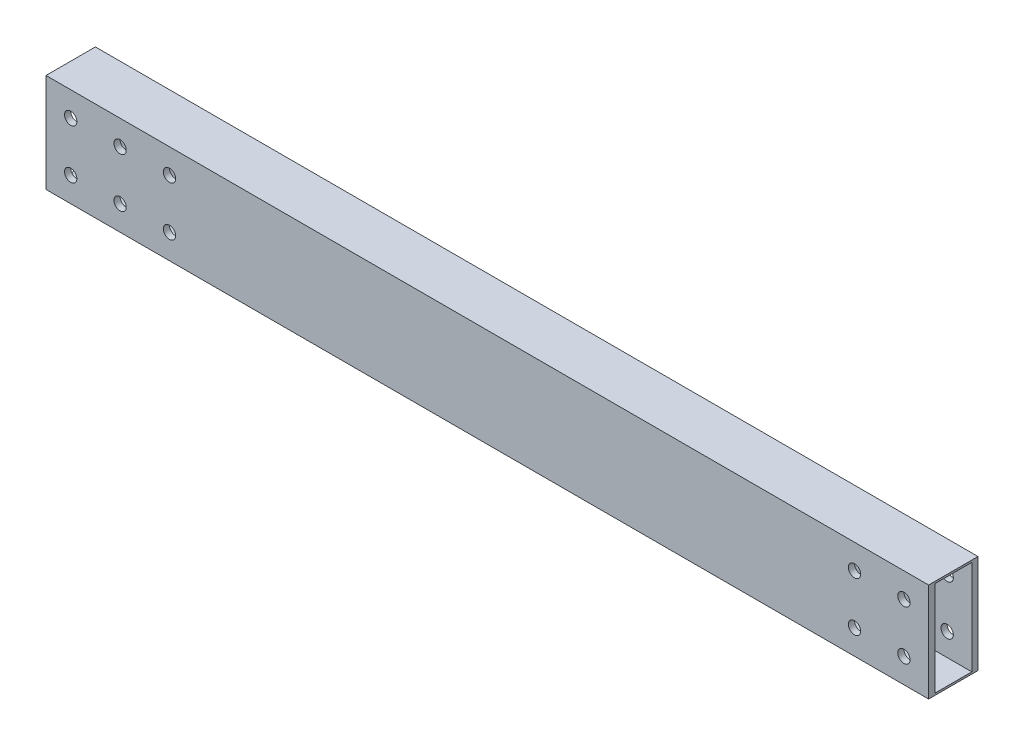
ISO-10303-21;
HEADER;
FILE_DESCRIPTION(('STEP AP214'),'2;1');
FILE_NAME('part.step','',(''),(''),'','','');
FILE_SCHEMA(('AUTOMOTIVE_DESIGN { 1 0 10303 214 1 1 1 1 }'));
ENDSEC;
DATA;
#1=APPLICATION_CONTEXT('core data for automotive mechanical design processes');
#2=APPLICATION_PROTOCOL_DEFINITION('international standard','automotive_design',2000,#1);
#3=PRODUCT_CONTEXT('',#1,'mechanical');
#4=PRODUCT('Part','Part','',(#3));
#5=PRODUCT_RELATED_PRODUCT_CATEGORY('part','',(#4));
#6=PRODUCT_DEFINITION_FORMATION('','',#4);
#7=PRODUCT_DEFINITION_CONTEXT('part definition',#1,'design');
#8=PRODUCT_DEFINITION('design','',#6,#7);
#9=PRODUCT_DEFINITION_SHAPE('','',#8);
#10=(LENGTH_UNIT() NAMED_UNIT(*) SI_UNIT(.MILLI.,.METRE.));
#11=(NAMED_UNIT(*) PLANE_ANGLE_UNIT() SI_UNIT($,.RADIAN.));
#12=(NAMED_UNIT(*) SI_UNIT($,.STERADIAN.) SOLID_ANGLE_UNIT());
#13=UNCERTAINTY_MEASURE_WITH_UNIT(LENGTH_MEASURE(1.E-05),#10,'distance_accuracy_value','');
#14=(GEOMETRIC_REPRESENTATION_CONTEXT(3) GLOBAL_UNCERTAINTY_ASSIGNED_CONTEXT((#13)) GLOBAL_UNIT_ASSIGNED_CONTEXT((#10,
#11,#12)) REPRESENTATION_CONTEXT('',''));
#15=CARTESIAN_POINT('',(0.,0.,0.));
#16=DIRECTION('',(0.,0.,1.));
#17=DIRECTION('',(1.,0.,0.));
#18=AXIS2_PLACEMENT_3D('',#15,#16,#17);
#19=CARTESIAN_POINT('',(453.936862,0.,0.));
#20=DIRECTION('',(0.,0.,-1.));
#21=DIRECTION('',(-1.,0.,0.));
#22=AXIS2_PLACEMENT_3D('',#19,#20,#21);
#23=PLANE('',#22);
#24=CARTESIAN_POINT('',(415.836862,12.7,0.));
#25=DIRECTION('',(0.,0.,-1.));
#26=DIRECTION('',(-1.,0.,0.));
#27=AXIS2_PLACEMENT_3D('',#24,#25,#26);
#28=CIRCLE('',#27,3.17499999999997);
#29=CARTESIAN_POINT('',(412.661862,12.7,0.));
#30=VERTEX_POINT('',#29);
#31=EDGE_CURVE('E146',#30,#30,#28,.T.);
#32=ORIENTED_EDGE('',*,*,#31,.T.);
#33=EDGE_LOOP('',(#32));
#34=FACE_BOUND('',#33,.T.);
#35=CARTESIAN_POINT('',(63.5,12.7,0.));
#36=DIRECTION('',(0.,0.,-1.));
#37=DIRECTION('',(-1.,0.,0.));
#38=AXIS2_PLACEMENT_3D('',#35,#36,#37);
#39=CIRCLE('',#38,3.175);
#40=CARTESIAN_POINT('',(60.325,12.7,0.));
#41=VERTEX_POINT('',#40);
#42=EDGE_CURVE('E263',#41,#41,#39,.T.);
#43=ORIENTED_EDGE('',*,*,#42,.T.);
#44=EDGE_LOOP('',(#43));
#45=FACE_BOUND('',#44,.T.);
#46=CARTESIAN_POINT('',(63.5,38.1,0.));
#47=DIRECTION('',(0.,0.,-1.));
#48=DIRECTION('',(-1.,0.,0.));
#49=AXIS2_PLACEMENT_3D('',#46,#47,#48);
#50=CIRCLE('',#49,3.175);
#51=CARTESIAN_POINT('',(60.325,38.1,0.));
#52=VERTEX_POINT('',#51);
#53=EDGE_CURVE('E257',#52,#52,#50,.T.);
#54=ORIENTED_EDGE('',*,*,#53,.T.);
#55=EDGE_LOOP('',(#54));
#56=FACE_BOUND('',#55,.T.);
#57=CARTESIAN_POINT('',(415.836862,38.1,0.));
#58=DIRECTION('',(0.,0.,-1.));
#59=DIRECTION('',(-1.,0.,0.));
#60=AXIS2_PLACEMENT_3D('',#57,#58,#59);
#61=CIRCLE('',#60,3.17499999999997);
#62=CARTESIAN_POINT('',(412.661862,38.1,0.));
#63=VERTEX_POINT('',#62);
#64=EDGE_CURVE('E252',#63,#63,#61,.T.);
#65=ORIENTED_EDGE('',*,*,#64,.T.);
#66=EDGE_LOOP('',(#65));
#67=FACE_BOUND('',#66,.T.);
#68=CARTESIAN_POINT('',(38.1,38.1,0.));
#69=DIRECTION('',(0.,0.,-1.));
#70=DIRECTION('',(-1.,0.,0.));
#71=AXIS2_PLACEMENT_3D('',#68,#69,#70);
#72=CIRCLE('',#71,3.175);
#73=CARTESIAN_POINT('',(34.925,38.1,0.));
#74=VERTEX_POINT('',#73);
#75=EDGE_CURVE('E247',#74,#74,#72,.T.);
#76=ORIENTED_EDGE('',*,*,#75,.T.);
#77=EDGE_LOOP('',(#76));
#78=FACE_BOUND('',#77,.T.);
#79=CARTESIAN_POINT('',(441.236862,12.7,0.));
#80=DIRECTION('',(0.,0.,-1.));
#81=DIRECTION('',(-1.,0.,0.));
#82=AXIS2_PLACEMENT_3D('',#79,#80,#81);
#83=CIRCLE('',#82,3.17499999999997);
#84=CARTESIAN_POINT('',(438.061862,12.7,0.));
#85=VERTEX_POINT('',#84);
#86=EDGE_CURVE('E241',#85,#85,#83,.T.);
#87=ORIENTED_EDGE('',*,*,#86,.T.);
#88=EDGE_LOOP('',(#87));
#89=FACE_BOUND('',#88,.T.);
#90=CARTESIAN_POINT('',(12.7,12.7,0.));
#91=DIRECTION('',(0.,0.,-1.));
#92=DIRECTION('',(-1.,0.,0.));
#93=AXIS2_PLACEMENT_3D('',#90,#91,#92);
#94=CIRCLE('',#93,3.175);
#95=CARTESIAN_POINT('',(9.525,12.7,0.));
#96=VERTEX_POINT('',#95);
#97=EDGE_CURVE('E235',#96,#96,#94,.T.);
#98=ORIENTED_EDGE('',*,*,#97,.T.);
#99=EDGE_LOOP('',(#98));
#100=FACE_BOUND('',#99,.T.);
#101=CARTESIAN_POINT('',(38.1,12.7,0.));
#102=DIRECTION('',(0.,0.,-1.));
#103=DIRECTION('',(-1.,0.,0.));
#104=AXIS2_PLACEMENT_3D('',#101,#102,#103);
#105=CIRCLE('',#104,3.175);
#106=CARTESIAN_POINT('',(34.925,12.7,0.));
#107=VERTEX_POINT('',#106);
#108=EDGE_CURVE('E229',#107,#107,#105,.T.);
#109=ORIENTED_EDGE('',*,*,#108,.T.);
#110=EDGE_LOOP('',(#109));
#111=FACE_BOUND('',#110,.T.);
#112=CARTESIAN_POINT('',(441.236862,38.1,0.));
#113=DIRECTION('',(0.,0.,-1.));
#114=DIRECTION('',(-1.,0.,0.));
#115=AXIS2_PLACEMENT_3D('',#112,#113,#114);
#116=CIRCLE('',#115,3.17499999999997);
#117=CARTESIAN_POINT('',(438.061862,38.1,0.));
#118=VERTEX_POINT('',#117);
#119=EDGE_CURVE('E223',#118,#118,#116,.T.);
#120=ORIENTED_EDGE('',*,*,#119,.T.);
#121=EDGE_LOOP('',(#120));
#122=FACE_BOUND('',#121,.T.);
#123=CARTESIAN_POINT('',(12.7,38.1,0.));
#124=DIRECTION('',(0.,0.,-1.));
#125=DIRECTION('',(-1.,0.,0.));
#126=AXIS2_PLACEMENT_3D('',#123,#124,#125);
#127=CIRCLE('',#126,3.175);
#128=CARTESIAN_POINT('',(9.525,38.1,0.));
#129=VERTEX_POINT('',#128);
#130=EDGE_CURVE('E217',#129,#129,#127,.T.);
#131=ORIENTED_EDGE('',*,*,#130,.T.);
#132=EDGE_LOOP('',(#131));
#133=FACE_BOUND('',#132,.T.);
#134=DIRECTION('',(0.,-1.,0.));
#135=VECTOR('',#134,1.);
#136=CARTESIAN_POINT('',(0.,0.,0.));
#137=LINE('',#136,#135);
#138=CARTESIAN_POINT('',(0.,50.8,0.));
#139=VERTEX_POINT('',#138);
#140=CARTESIAN_POINT('',(0.,0.,0.));
#141=VERTEX_POINT('',#140);
#142=EDGE_CURVE('E164',#139,#141,#137,.T.);
#143=ORIENTED_EDGE('',*,*,#142,.T.);
#144=DIRECTION('',(-1.,0.,0.));
#145=VECTOR('',#144,1.);
#146=CARTESIAN_POINT('',(453.936862,0.,0.));
#147=LINE('',#146,#145);
#148=CARTESIAN_POINT('',(453.936862,0.,0.));
#149=VERTEX_POINT('',#148);
#150=EDGE_CURVE('E11',#149,#141,#147,.T.);
#151=ORIENTED_EDGE('',*,*,#150,.F.);
#152=DIRECTION('',(0.,-1.,0.));
#153=VECTOR('',#152,1.);
#154=CARTESIAN_POINT('',(453.936862,0.,0.));
#155=LINE('',#154,#153);
#156=CARTESIAN_POINT('',(453.936862,50.8,0.));
#157=VERTEX_POINT('',#156);
#158=EDGE_CURVE('E170',#157,#149,#155,.T.);
#159=ORIENTED_EDGE('',*,*,#158,.F.);
#160=DIRECTION('',(-1.,0.,0.));
#161=VECTOR('',#160,1.);
#162=CARTESIAN_POINT('',(453.936862,50.8,0.));
#163=LINE('',#162,#161);
#164=EDGE_CURVE('E184',#157,#139,#163,.T.);
#165=ORIENTED_EDGE('',*,*,#164,.T.);
#166=EDGE_LOOP('',(#143,#151,#159,#165));
#167=FACE_BOUND('',#166,.T.);
#168=ADVANCED_FACE('F51',(#34,#45,#56,#67,#78,#89,#100,#111,#122,#133,#167),#23,.F.);
#169=CARTESIAN_POINT('',(453.936862,0.,0.));
#170=DIRECTION('',(0.,1.,0.));
#171=DIRECTION('',(0.,0.,1.));
#172=AXIS2_PLACEMENT_3D('',#169,#170,#171);
#173=PLANE('',#172);
#174=DIRECTION('',(0.,0.,-1.));
#175=VECTOR('',#174,1.);
#176=CARTESIAN_POINT('',(0.,0.,0.));
#177=LINE('',#176,#175);
#178=CARTESIAN_POINT('',(0.,0.,-25.4));
#179=VERTEX_POINT('',#178);
#180=EDGE_CURVE('E188',#141,#179,#177,.T.);
#181=ORIENTED_EDGE('',*,*,#180,.T.);
#182=DIRECTION('',(-1.,0.,0.));
#183=VECTOR('',#182,1.);
#184=CARTESIAN_POINT('',(453.936862,0.,-25.4));
#185=LINE('',#184,#183);
#186=CARTESIAN_POINT('',(453.936862,0.,-25.4));
#187=VERTEX_POINT('',#186);
#188=EDGE_CURVE('E60',#187,#179,#185,.T.);
#189=ORIENTED_EDGE('',*,*,#188,.F.);
#190=DIRECTION('',(0.,0.,-1.));
#191=VECTOR('',#190,1.);
#192=CARTESIAN_POINT('',(453.936862,0.,0.));
#193=LINE('',#192,#191);
#194=EDGE_CURVE('E174',#149,#187,#193,.T.);
#195=ORIENTED_EDGE('',*,*,#194,.F.);
#196=ORIENTED_EDGE('',*,*,#150,.T.);
#197=EDGE_LOOP('',(#181,#189,#195,#196));
#198=FACE_BOUND('',#197,.T.);
#199=ADVANCED_FACE('F313',(#198),#173,.F.);
#200=CARTESIAN_POINT('',(453.936862,0.,-25.4));
#201=DIRECTION('',(0.,0.,1.));
#202=DIRECTION('',(1.,0.,0.));
#203=AXIS2_PLACEMENT_3D('',#200,#201,#202);
#204=PLANE('',#203);
#205=CARTESIAN_POINT('',(415.836862,12.7,-25.4));
#206=DIRECTION('',(0.,0.,1.));
#207=DIRECTION('',(1.,0.,0.));
#208=AXIS2_PLACEMENT_3D('',#205,#206,#207);
#209=CIRCLE('',#208,3.17499999999997);
#210=CARTESIAN_POINT('',(419.011862,12.7,-25.4));
#211=VERTEX_POINT('',#210);
#212=EDGE_CURVE('E537',#211,#211,#209,.T.);
#213=ORIENTED_EDGE('',*,*,#212,.T.);
#214=EDGE_LOOP('',(#213));
#215=FACE_BOUND('',#214,.T.);
#216=CARTESIAN_POINT('',(63.5,12.7,-25.4));
#217=DIRECTION('',(0.,0.,1.));
#218=DIRECTION('',(1.,0.,0.));
#219=AXIS2_PLACEMENT_3D('',#216,#217,#218);
#220=CIRCLE('',#219,3.175);
#221=CARTESIAN_POINT('',(66.675,12.7,-25.4));
#222=VERTEX_POINT('',#221);
#223=EDGE_CURVE('E529',#222,#222,#220,.T.);
#224=ORIENTED_EDGE('',*,*,#223,.T.);
#225=EDGE_LOOP('',(#224));
#226=FACE_BOUND('',#225,.T.);
#227=CARTESIAN_POINT('',(63.5,38.1,-25.4));
#228=DIRECTION('',(0.,0.,1.));
#229=DIRECTION('',(1.,0.,0.));
#230=AXIS2_PLACEMENT_3D('',#227,#228,#229);
#231=CIRCLE('',#230,3.175);
#232=CARTESIAN_POINT('',(66.675,38.1,-25.4));
#233=VERTEX_POINT('',#232);
#234=EDGE_CURVE('E522',#233,#233,#231,.T.);
#235=ORIENTED_EDGE('',*,*,#234,.T.);
#236=EDGE_LOOP('',(#235));
#237=FACE_BOUND('',#236,.T.);
#238=CARTESIAN_POINT('',(415.836862,38.1,-25.4));
#239=DIRECTION('',(0.,0.,1.));
#240=DIRECTION('',(1.,0.,0.));
#241=AXIS2_PLACEMENT_3D('',#238,#239,#240);
#242=CIRCLE('',#241,3.17499999999997);
#243=CARTESIAN_POINT('',(419.011862,38.1,-25.4));
#244=VERTEX_POINT('',#243);
#245=EDGE_CURVE('E510',#244,#244,#242,.T.);
#246=ORIENTED_EDGE('',*,*,#245,.T.);
#247=EDGE_LOOP('',(#246));
#248=FACE_BOUND('',#247,.T.);
#249=CARTESIAN_POINT('',(38.1,38.1,-25.4));
#250=DIRECTION('',(0.,0.,1.));
#251=DIRECTION('',(1.,0.,0.));
#252=AXIS2_PLACEMENT_3D('',#249,#250,#251);
#253=CIRCLE('',#252,3.175);
#254=CARTESIAN_POINT('',(41.275,38.1,-25.4));
#255=VERTEX_POINT('',#254);
#256=EDGE_CURVE('E444',#255,#255,#253,.T.);
#257=ORIENTED_EDGE('',*,*,#256,.T.);
#258=EDGE_LOOP('',(#257));
#259=FACE_BOUND('',#258,.T.);
#260=CARTESIAN_POINT('',(441.236862,12.7,-25.4));
#261=DIRECTION('',(0.,0.,1.));
#262=DIRECTION('',(1.,0.,0.));
#263=AXIS2_PLACEMENT_3D('',#260,#261,#262);
#264=CIRCLE('',#263,3.17499999999997);
#265=CARTESIAN_POINT('',(444.411862,12.7,-25.4));
#266=VERTEX_POINT('',#265);
#267=EDGE_CURVE('E448',#266,#266,#264,.T.);
#268=ORIENTED_EDGE('',*,*,#267,.T.);
#269=EDGE_LOOP('',(#268));
#270=FACE_BOUND('',#269,.T.);
#271=CARTESIAN_POINT('',(12.7,12.7,-25.4));
#272=DIRECTION('',(0.,0.,1.));
#273=DIRECTION('',(1.,0.,0.));
#274=AXIS2_PLACEMENT_3D('',#271,#272,#273);
#275=CIRCLE('',#274,3.175);
#276=CARTESIAN_POINT('',(15.875,12.7,-25.4));
#277=VERTEX_POINT('',#276);
#278=EDGE_CURVE('E421',#277,#277,#275,.T.);
#279=ORIENTED_EDGE('',*,*,#278,.T.);
#280=EDGE_LOOP('',(#279));
#281=FACE_BOUND('',#280,.T.);
#282=CARTESIAN_POINT('',(38.1,12.7,-25.4));
#283=DIRECTION('',(0.,0.,1.));
#284=DIRECTION('',(1.,0.,0.));
#285=AXIS2_PLACEMENT_3D('',#282,#283,#284);
#286=CIRCLE('',#285,3.175);
#287=CARTESIAN_POINT('',(41.275,12.7,-25.4));
#288=VERTEX_POINT('',#287);
#289=EDGE_CURVE('E521',#288,#288,#286,.T.);
#290=ORIENTED_EDGE('',*,*,#289,.T.);
#291=EDGE_LOOP('',(#290));
#292=FACE_BOUND('',#291,.T.);
#293=CARTESIAN_POINT('',(441.236862,38.1,-25.4));
#294=DIRECTION('',(0.,0.,1.));
#295=DIRECTION('',(1.,0.,0.));
#296=AXIS2_PLACEMENT_3D('',#293,#294,#295);
#297=CIRCLE('',#296,3.17499999999997);
#298=CARTESIAN_POINT('',(444.411862,38.1,-25.4));
#299=VERTEX_POINT('',#298);
#300=EDGE_CURVE('E532',#299,#299,#297,.T.);
#301=ORIENTED_EDGE('',*,*,#300,.T.);
#302=EDGE_LOOP('',(#301));
#303=FACE_BOUND('',#302,.T.);
#304=CARTESIAN_POINT('',(12.7,38.1,-25.4));
#305=DIRECTION('',(0.,0.,1.));
#306=DIRECTION('',(1.,0.,0.));
#307=AXIS2_PLACEMENT_3D('',#304,#305,#306);
#308=CIRCLE('',#307,3.175);
#309=CARTESIAN_POINT('',(15.875,38.1,-25.4));
#310=VERTEX_POINT('',#309);
#311=EDGE_CURVE('E211',#310,#310,#308,.T.);
#312=ORIENTED_EDGE('',*,*,#311,.T.);
#313=EDGE_LOOP('',(#312));
#314=FACE_BOUND('',#313,.T.);
#315=DIRECTION('',(0.,1.,0.));
#316=VECTOR('',#315,1.);
#317=CARTESIAN_POINT('',(0.,0.,-25.4));
#318=LINE('',#317,#316);
#319=CARTESIAN_POINT('',(0.,50.8,-25.4));
#320=VERTEX_POINT('',#319);
#321=EDGE_CURVE('E191',#179,#320,#318,.T.);
#322=ORIENTED_EDGE('',*,*,#321,.T.);
#323=DIRECTION('',(-1.,0.,0.));
#324=VECTOR('',#323,1.);
#325=CARTESIAN_POINT('',(453.936862,50.8,-25.4));
#326=LINE('',#325,#324);
#327=CARTESIAN_POINT('',(453.936862,50.8,-25.4));
#328=VERTEX_POINT('',#327);
#329=EDGE_CURVE('E199',#328,#320,#326,.T.);
#330=ORIENTED_EDGE('',*,*,#329,.F.);
#331=DIRECTION('',(0.,1.,0.));
#332=VECTOR('',#331,1.);
#333=CARTESIAN_POINT('',(453.936862,0.,-25.4));
#334=LINE('',#333,#332);
#335=EDGE_CURVE('E178',#187,#328,#334,.T.);
#336=ORIENTED_EDGE('',*,*,#335,.F.);
#337=ORIENTED_EDGE('',*,*,#188,.T.);
#338=EDGE_LOOP('',(#322,#330,#336,#337));
#339=FACE_BOUND('',#338,.T.);
#340=ADVANCED_FACE('F318',(#215,#226,#237,#248,#259,#270,#281,#292,#303,#314,#339),#204,.F.);
#341=CARTESIAN_POINT('',(453.936862,50.8,0.));
#342=DIRECTION('',(0.,-1.,0.));
#343=DIRECTION('',(0.,0.,-1.));
#344=AXIS2_PLACEMENT_3D('',#341,#342,#343);
#345=PLANE('',#344);
#346=DIRECTION('',(0.,0.,1.));
#347=VECTOR('',#346,1.);
#348=CARTESIAN_POINT('',(0.,50.8,0.));
#349=LINE('',#348,#347);
#350=EDGE_CURVE('E175',#320,#139,#349,.T.);
#351=ORIENTED_EDGE('',*,*,#350,.T.);
#352=ORIENTED_EDGE('',*,*,#164,.F.);
#353=DIRECTION('',(0.,0.,1.));
#354=VECTOR('',#353,1.);
#355=CARTESIAN_POINT('',(453.936862,50.8,0.));
#356=LINE('',#355,#354);
#357=EDGE_CURVE('E181',#328,#157,#356,.T.);
#358=ORIENTED_EDGE('',*,*,#357,.F.);
#359=ORIENTED_EDGE('',*,*,#329,.T.);
#360=EDGE_LOOP('',(#351,#352,#358,#359));
#361=FACE_BOUND('',#360,.T.);
#362=ADVANCED_FACE('F358',(#361),#345,.F.);
#363=CARTESIAN_POINT('',(453.936862,0.,0.));
#364=DIRECTION('',(-1.,0.,0.));
#365=DIRECTION('',(0.,0.,1.));
#366=AXIS2_PLACEMENT_3D('',#363,#364,#365);
#367=PLANE('',#366);
#368=DIRECTION('',(0.,0.,-1.));
#369=VECTOR('',#368,1.);
#370=CARTESIAN_POINT('',(453.936862,1.016,-3.17500000000001));
#371=LINE('',#370,#369);
#372=CARTESIAN_POINT('',(453.936862,1.016,-3.17500000000001));
#373=VERTEX_POINT('',#372);
#374=CARTESIAN_POINT('',(453.936862,1.016,-22.225));
#375=VERTEX_POINT('',#374);
#376=EDGE_CURVE('E155',#373,#375,#371,.T.);
#377=ORIENTED_EDGE('',*,*,#376,.F.);
#378=DIRECTION('',(0.,-1.,0.));
#379=VECTOR('',#378,1.);
#380=CARTESIAN_POINT('',(453.936862,49.784,-3.175));
#381=LINE('',#380,#379);
#382=CARTESIAN_POINT('',(453.936862,49.784,-3.175));
#383=VERTEX_POINT('',#382);
#384=EDGE_CURVE('E68',#383,#373,#381,.T.);
#385=ORIENTED_EDGE('',*,*,#384,.F.);
#386=DIRECTION('',(0.,0.,1.));
#387=VECTOR('',#386,1.);
#388=CARTESIAN_POINT('',(453.936862,49.784,-3.175));
#389=LINE('',#388,#387);
#390=CARTESIAN_POINT('',(453.936862,49.784,-22.225));
#391=VERTEX_POINT('',#390);
#392=EDGE_CURVE('E139',#391,#383,#389,.T.);
#393=ORIENTED_EDGE('',*,*,#392,.F.);
#394=DIRECTION('',(0.,1.,0.));
#395=VECTOR('',#394,1.);
#396=CARTESIAN_POINT('',(453.936862,49.784,-22.225));
#397=LINE('',#396,#395);
#398=EDGE_CURVE('E143',#375,#391,#397,.T.);
#399=ORIENTED_EDGE('',*,*,#398,.F.);
#400=EDGE_LOOP('',(#377,#385,#393,#399));
#401=FACE_BOUND('',#400,.T.);
#402=ORIENTED_EDGE('',*,*,#158,.T.);
#403=ORIENTED_EDGE('',*,*,#194,.T.);
#404=ORIENTED_EDGE('',*,*,#335,.T.);
#405=ORIENTED_EDGE('',*,*,#357,.T.);
#406=EDGE_LOOP('',(#402,#403,#404,#405));
#407=FACE_BOUND('',#406,.T.);
#408=ADVANCED_FACE('F354',(#401,#407),#367,.F.);
#409=CARTESIAN_POINT('',(0.,0.,0.));
#410=DIRECTION('',(-1.,0.,0.));
#411=DIRECTION('',(0.,0.,1.));
#412=AXIS2_PLACEMENT_3D('',#409,#410,#411);
#413=PLANE('',#412);
#414=DIRECTION('',(0.,-1.,0.));
#415=VECTOR('',#414,1.);
#416=CARTESIAN_POINT('',(0.,49.784,-3.175));
#417=LINE('',#416,#415);
#418=CARTESIAN_POINT('',(0.,49.784,-3.175));
#419=VERTEX_POINT('',#418);
#420=CARTESIAN_POINT('',(0.,1.016,-3.17500000000001));
#421=VERTEX_POINT('',#420);
#422=EDGE_CURVE('E120',#419,#421,#417,.T.);
#423=ORIENTED_EDGE('',*,*,#422,.T.);
#424=DIRECTION('',(0.,0.,-1.));
#425=VECTOR('',#424,1.);
#426=CARTESIAN_POINT('',(0.,1.016,-3.17500000000001));
#427=LINE('',#426,#425);
#428=CARTESIAN_POINT('',(0.,1.016,-22.225));
#429=VERTEX_POINT('',#428);
#430=EDGE_CURVE('E130',#421,#429,#427,.T.);
#431=ORIENTED_EDGE('',*,*,#430,.T.);
#432=DIRECTION('',(0.,1.,0.));
#433=VECTOR('',#432,1.);
#434=CARTESIAN_POINT('',(0.,49.784,-22.225));
#435=LINE('',#434,#433);
#436=CARTESIAN_POINT('',(0.,49.784,-22.225));
#437=VERTEX_POINT('',#436);
#438=EDGE_CURVE('E76',#429,#437,#435,.T.);
#439=ORIENTED_EDGE('',*,*,#438,.T.);
#440=DIRECTION('',(0.,0.,1.));
#441=VECTOR('',#440,1.);
#442=CARTESIAN_POINT('',(0.,49.784,-3.175));
#443=LINE('',#442,#441);
#444=EDGE_CURVE('E127',#437,#419,#443,.T.);
#445=ORIENTED_EDGE('',*,*,#444,.T.);
#446=EDGE_LOOP('',(#423,#431,#439,#445));
#447=FACE_BOUND('',#446,.T.);
#448=ORIENTED_EDGE('',*,*,#142,.F.);
#449=ORIENTED_EDGE('',*,*,#350,.F.);
#450=ORIENTED_EDGE('',*,*,#321,.F.);
#451=ORIENTED_EDGE('',*,*,#180,.F.);
#452=EDGE_LOOP('',(#448,#449,#450,#451));
#453=FACE_BOUND('',#452,.T.);
#454=ADVANCED_FACE('F135',(#447,#453),#413,.T.);
#455=CARTESIAN_POINT('',(0.,49.784,-3.175));
#456=DIRECTION('',(0.,0.,1.));
#457=DIRECTION('',(0.,-1.,0.));
#458=AXIS2_PLACEMENT_3D('',#455,#456,#457);
#459=PLANE('',#458);
#460=CARTESIAN_POINT('',(415.836862,12.7,-3.175));
#461=DIRECTION('',(0.,0.,1.));
#462=DIRECTION('',(0.,-1.,0.));
#463=AXIS2_PLACEMENT_3D('',#460,#461,#462);
#464=CIRCLE('',#463,3.17499999999997);
#465=CARTESIAN_POINT('',(415.836862,9.52500000000003,-3.175));
#466=VERTEX_POINT('',#465);
#467=EDGE_CURVE('E276',#466,#466,#464,.T.);
#468=ORIENTED_EDGE('',*,*,#467,.T.);
#469=EDGE_LOOP('',(#468));
#470=FACE_BOUND('',#469,.T.);
#471=CARTESIAN_POINT('',(63.5,12.7,-3.175));
#472=DIRECTION('',(0.,0.,1.));
#473=DIRECTION('',(0.,-1.,0.));
#474=AXIS2_PLACEMENT_3D('',#471,#472,#473);
#475=CIRCLE('',#474,3.175);
#476=CARTESIAN_POINT('',(63.5,9.525,-3.175));
#477=VERTEX_POINT('',#476);
#478=EDGE_CURVE('E256',#477,#477,#475,.T.);
#479=ORIENTED_EDGE('',*,*,#478,.T.);
#480=EDGE_LOOP('',(#479));
#481=FACE_BOUND('',#480,.T.);
#482=CARTESIAN_POINT('',(63.5,38.1,-3.175));
#483=DIRECTION('',(0.,0.,1.));
#484=DIRECTION('',(0.,-1.,0.));
#485=AXIS2_PLACEMENT_3D('',#482,#483,#484);
#486=CIRCLE('',#485,3.175);
#487=CARTESIAN_POINT('',(63.5,34.925,-3.175));
#488=VERTEX_POINT('',#487);
#489=EDGE_CURVE('E251',#488,#488,#486,.T.);
#490=ORIENTED_EDGE('',*,*,#489,.T.);
#491=EDGE_LOOP('',(#490));
#492=FACE_BOUND('',#491,.T.);
#493=CARTESIAN_POINT('',(415.836862,38.1,-3.175));
#494=DIRECTION('',(0.,0.,1.));
#495=DIRECTION('',(0.,-1.,0.));
#496=AXIS2_PLACEMENT_3D('',#493,#494,#495);
#497=CIRCLE('',#496,3.17499999999997);
#498=CARTESIAN_POINT('',(415.836862,34.925,-3.175));
#499=VERTEX_POINT('',#498);
#500=EDGE_CURVE('E246',#499,#499,#497,.T.);
#501=ORIENTED_EDGE('',*,*,#500,.T.);
#502=EDGE_LOOP('',(#501));
#503=FACE_BOUND('',#502,.T.);
#504=CARTESIAN_POINT('',(38.1,38.1,-3.175));
#505=DIRECTION('',(0.,0.,1.));
#506=DIRECTION('',(0.,-1.,0.));
#507=AXIS2_PLACEMENT_3D('',#504,#505,#506);
#508=CIRCLE('',#507,3.175);
#509=CARTESIAN_POINT('',(38.1,34.925,-3.175));
#510=VERTEX_POINT('',#509);
#511=EDGE_CURVE('E240',#510,#510,#508,.T.);
#512=ORIENTED_EDGE('',*,*,#511,.T.);
#513=EDGE_LOOP('',(#512));
#514=FACE_BOUND('',#513,.T.);
#515=CARTESIAN_POINT('',(441.236862,12.7,-3.175));
#516=DIRECTION('',(0.,0.,1.));
#517=DIRECTION('',(0.,-1.,0.));
#518=AXIS2_PLACEMENT_3D('',#515,#516,#517);
#519=CIRCLE('',#518,3.17499999999997);
#520=CARTESIAN_POINT('',(441.236862,9.52500000000003,-3.175));
#521=VERTEX_POINT('',#520);
#522=EDGE_CURVE('E234',#521,#521,#519,.T.);
#523=ORIENTED_EDGE('',*,*,#522,.T.);
#524=EDGE_LOOP('',(#523));
#525=FACE_BOUND('',#524,.T.);
#526=CARTESIAN_POINT('',(12.7,12.7,-3.175));
#527=DIRECTION('',(0.,0.,1.));
#528=DIRECTION('',(0.,-1.,0.));
#529=AXIS2_PLACEMENT_3D('',#526,#527,#528);
#530=CIRCLE('',#529,3.175);
#531=CARTESIAN_POINT('',(12.7,9.525,-3.175));
#532=VERTEX_POINT('',#531);
#533=EDGE_CURVE('E228',#532,#532,#530,.T.);
#534=ORIENTED_EDGE('',*,*,#533,.T.);
#535=EDGE_LOOP('',(#534));
#536=FACE_BOUND('',#535,.T.);
#537=CARTESIAN_POINT('',(38.1,12.7,-3.175));
#538=DIRECTION('',(0.,0.,1.));
#539=DIRECTION('',(0.,-1.,0.));
#540=AXIS2_PLACEMENT_3D('',#537,#538,#539);
#541=CIRCLE('',#540,3.175);
#542=CARTESIAN_POINT('',(38.1,9.525,-3.175));
#543=VERTEX_POINT('',#542);
#544=EDGE_CURVE('E222',#543,#543,#541,.T.);
#545=ORIENTED_EDGE('',*,*,#544,.T.);
#546=EDGE_LOOP('',(#545));
#547=FACE_BOUND('',#546,.T.);
#548=CARTESIAN_POINT('',(441.236862,38.1,-3.175));
#549=DIRECTION('',(0.,0.,1.));
#550=DIRECTION('',(0.,-1.,0.));
#551=AXIS2_PLACEMENT_3D('',#548,#549,#550);
#552=CIRCLE('',#551,3.17499999999997);
#553=CARTESIAN_POINT('',(441.236862,34.925,-3.175));
#554=VERTEX_POINT('',#553);
#555=EDGE_CURVE('E216',#554,#554,#552,.T.);
#556=ORIENTED_EDGE('',*,*,#555,.T.);
#557=EDGE_LOOP('',(#556));
#558=FACE_BOUND('',#557,.T.);
#559=CARTESIAN_POINT('',(12.7,38.1,-3.175));
#560=DIRECTION('',(0.,0.,1.));
#561=DIRECTION('',(0.,-1.,0.));
#562=AXIS2_PLACEMENT_3D('',#559,#560,#561);
#563=CIRCLE('',#562,3.175);
#564=CARTESIAN_POINT('',(12.7,34.925,-3.175));
#565=VERTEX_POINT('',#564);
#566=EDGE_CURVE('E210',#565,#565,#563,.T.);
#567=ORIENTED_EDGE('',*,*,#566,.T.);
#568=EDGE_LOOP('',(#567));
#569=FACE_BOUND('',#568,.T.);
#570=ORIENTED_EDGE('',*,*,#384,.T.);
#571=DIRECTION('',(1.,0.,0.));
#572=VECTOR('',#571,1.);
#573=CARTESIAN_POINT('',(0.,1.016,-3.17500000000001));
#574=LINE('',#573,#572);
#575=EDGE_CURVE('E116',#421,#373,#574,.T.);
#576=ORIENTED_EDGE('',*,*,#575,.F.);
#577=ORIENTED_EDGE('',*,*,#422,.F.);
#578=DIRECTION('',(1.,0.,0.));
#579=VECTOR('',#578,1.);
#580=CARTESIAN_POINT('',(0.,49.784,-3.175));
#581=LINE('',#580,#579);
#582=EDGE_CURVE('E161',#419,#383,#581,.T.);
#583=ORIENTED_EDGE('',*,*,#582,.T.);
#584=EDGE_LOOP('',(#570,#576,#577,#583));
#585=FACE_BOUND('',#584,.T.);
#586=ADVANCED_FACE('F118',(#470,#481,#492,#503,#514,#525,#536,#547,#558,#569,#585),#459,.F.);
#587=CARTESIAN_POINT('',(0.,49.784,-3.175));
#588=DIRECTION('',(0.,1.,0.));
#589=DIRECTION('',(0.,0.,1.));
#590=AXIS2_PLACEMENT_3D('',#587,#588,#589);
#591=PLANE('',#590);
#592=ORIENTED_EDGE('',*,*,#392,.T.);
#593=ORIENTED_EDGE('',*,*,#582,.F.);
#594=ORIENTED_EDGE('',*,*,#444,.F.);
#595=DIRECTION('',(1.,0.,0.));
#596=VECTOR('',#595,1.);
#597=CARTESIAN_POINT('',(0.,49.784,-22.225));
#598=LINE('',#597,#596);
#599=EDGE_CURVE('E165',#437,#391,#598,.T.);
#600=ORIENTED_EDGE('',*,*,#599,.T.);
#601=EDGE_LOOP('',(#592,#593,#594,#600));
#602=FACE_BOUND('',#601,.T.);
#603=ADVANCED_FACE('F378',(#602),#591,.F.);
#604=CARTESIAN_POINT('',(0.,49.784,-22.225));
#605=DIRECTION('',(0.,0.,-1.));
#606=DIRECTION('',(0.,1.,0.));
#607=AXIS2_PLACEMENT_3D('',#604,#605,#606);
#608=PLANE('',#607);
#609=CARTESIAN_POINT('',(415.836862,12.7,-22.225));
#610=DIRECTION('',(0.,0.,-1.));
#611=DIRECTION('',(0.,1.,0.));
#612=AXIS2_PLACEMENT_3D('',#609,#610,#611);
#613=CIRCLE('',#612,3.17499999999997);
#614=CARTESIAN_POINT('',(415.836862,15.875,-22.225));
#615=VERTEX_POINT('',#614);
#616=EDGE_CURVE('E54',#615,#615,#613,.T.);
#617=ORIENTED_EDGE('',*,*,#616,.T.);
#618=EDGE_LOOP('',(#617));
#619=FACE_BOUND('',#618,.T.);
#620=CARTESIAN_POINT('',(63.5,12.7,-22.225));
#621=DIRECTION('',(0.,0.,-1.));
#622=DIRECTION('',(0.,1.,0.));
#623=AXIS2_PLACEMENT_3D('',#620,#621,#622);
#624=CIRCLE('',#623,3.175);
#625=CARTESIAN_POINT('',(63.5,15.875,-22.225));
#626=VERTEX_POINT('',#625);
#627=EDGE_CURVE('E253',#626,#626,#624,.T.);
#628=ORIENTED_EDGE('',*,*,#627,.T.);
#629=EDGE_LOOP('',(#628));
#630=FACE_BOUND('',#629,.T.);
#631=CARTESIAN_POINT('',(63.5,38.1,-22.225));
#632=DIRECTION('',(0.,0.,-1.));
#633=DIRECTION('',(0.,1.,0.));
#634=AXIS2_PLACEMENT_3D('',#631,#632,#633);
#635=CIRCLE('',#634,3.175);
#636=CARTESIAN_POINT('',(63.5,41.275,-22.225));
#637=VERTEX_POINT('',#636);
#638=EDGE_CURVE('E248',#637,#637,#635,.T.);
#639=ORIENTED_EDGE('',*,*,#638,.T.);
#640=EDGE_LOOP('',(#639));
#641=FACE_BOUND('',#640,.T.);
#642=CARTESIAN_POINT('',(415.836862,38.1,-22.225));
#643=DIRECTION('',(0.,0.,-1.));
#644=DIRECTION('',(0.,1.,0.));
#645=AXIS2_PLACEMENT_3D('',#642,#643,#644);
#646=CIRCLE('',#645,3.17499999999997);
#647=CARTESIAN_POINT('',(415.836862,41.275,-22.225));
#648=VERTEX_POINT('',#647);
#649=EDGE_CURVE('E242',#648,#648,#646,.T.);
#650=ORIENTED_EDGE('',*,*,#649,.T.);
#651=EDGE_LOOP('',(#650));
#652=FACE_BOUND('',#651,.T.);
#653=CARTESIAN_POINT('',(38.1,38.1,-22.225));
#654=DIRECTION('',(0.,0.,-1.));
#655=DIRECTION('',(0.,1.,0.));
#656=AXIS2_PLACEMENT_3D('',#653,#654,#655);
#657=CIRCLE('',#656,3.175);
#658=CARTESIAN_POINT('',(38.1,41.275,-22.225));
#659=VERTEX_POINT('',#658);
#660=EDGE_CURVE('E236',#659,#659,#657,.T.);
#661=ORIENTED_EDGE('',*,*,#660,.T.);
#662=EDGE_LOOP('',(#661));
#663=FACE_BOUND('',#662,.T.);
#664=CARTESIAN_POINT('',(441.236862,12.7,-22.225));
#665=DIRECTION('',(0.,0.,-1.));
#666=DIRECTION('',(0.,1.,0.));
#667=AXIS2_PLACEMENT_3D('',#664,#665,#666);
#668=CIRCLE('',#667,3.17499999999997);
#669=CARTESIAN_POINT('',(441.236862,15.875,-22.225));
#670=VERTEX_POINT('',#669);
#671=EDGE_CURVE('E230',#670,#670,#668,.T.);
#672=ORIENTED_EDGE('',*,*,#671,.T.);
#673=EDGE_LOOP('',(#672));
#674=FACE_BOUND('',#673,.T.);
#675=CARTESIAN_POINT('',(12.7,12.7,-22.225));
#676=DIRECTION('',(0.,0.,-1.));
#677=DIRECTION('',(0.,1.,0.));
#678=AXIS2_PLACEMENT_3D('',#675,#676,#677);
#679=CIRCLE('',#678,3.175);
#680=CARTESIAN_POINT('',(12.7,15.875,-22.225));
#681=VERTEX_POINT('',#680);
#682=EDGE_CURVE('E224',#681,#681,#679,.T.);
#683=ORIENTED_EDGE('',*,*,#682,.T.);
#684=EDGE_LOOP('',(#683));
#685=FACE_BOUND('',#684,.T.);
#686=CARTESIAN_POINT('',(38.1,12.7,-22.225));
#687=DIRECTION('',(0.,0.,-1.));
#688=DIRECTION('',(0.,1.,0.));
#689=AXIS2_PLACEMENT_3D('',#686,#687,#688);
#690=CIRCLE('',#689,3.175);
#691=CARTESIAN_POINT('',(38.1,15.875,-22.225));
#692=VERTEX_POINT('',#691);
#693=EDGE_CURVE('E218',#692,#692,#690,.T.);
#694=ORIENTED_EDGE('',*,*,#693,.T.);
#695=EDGE_LOOP('',(#694));
#696=FACE_BOUND('',#695,.T.);
#697=CARTESIAN_POINT('',(441.236862,38.1,-22.225));
#698=DIRECTION('',(0.,0.,-1.));
#699=DIRECTION('',(0.,1.,0.));
#700=AXIS2_PLACEMENT_3D('',#697,#698,#699);
#701=CIRCLE('',#700,3.17499999999997);
#702=CARTESIAN_POINT('',(441.236862,41.275,-22.225));
#703=VERTEX_POINT('',#702);
#704=EDGE_CURVE('E212',#703,#703,#701,.T.);
#705=ORIENTED_EDGE('',*,*,#704,.T.);
#706=EDGE_LOOP('',(#705));
#707=FACE_BOUND('',#706,.T.);
#708=CARTESIAN_POINT('',(12.7,38.1,-22.225));
#709=DIRECTION('',(0.,0.,-1.));
#710=DIRECTION('',(0.,1.,0.));
#711=AXIS2_PLACEMENT_3D('',#708,#709,#710);
#712=CIRCLE('',#711,3.175);
#713=CARTESIAN_POINT('',(12.7,41.275,-22.225));
#714=VERTEX_POINT('',#713);
#715=EDGE_CURVE('E206',#714,#714,#712,.T.);
#716=ORIENTED_EDGE('',*,*,#715,.T.);
#717=EDGE_LOOP('',(#716));
#718=FACE_BOUND('',#717,.T.);
#719=ORIENTED_EDGE('',*,*,#398,.T.);
#720=ORIENTED_EDGE('',*,*,#599,.F.);
#721=ORIENTED_EDGE('',*,*,#438,.F.);
#722=DIRECTION('',(1.,0.,0.));
#723=VECTOR('',#722,1.);
#724=CARTESIAN_POINT('',(0.,1.016,-22.225));
#725=LINE('',#724,#723);
#726=EDGE_CURVE('E126',#429,#375,#725,.T.);
#727=ORIENTED_EDGE('',*,*,#726,.T.);
#728=EDGE_LOOP('',(#719,#720,#721,#727));
#729=FACE_BOUND('',#728,.T.);
#730=ADVANCED_FACE('F287',(#619,#630,#641,#652,#663,#674,#685,#696,#707,#718,#729),#608,.F.);
#731=CARTESIAN_POINT('',(0.,1.016,-3.17500000000001));
#732=DIRECTION('',(0.,-1.,0.));
#733=DIRECTION('',(0.,0.,-1.));
#734=AXIS2_PLACEMENT_3D('',#731,#732,#733);
#735=PLANE('',#734);
#736=ORIENTED_EDGE('',*,*,#376,.T.);
#737=ORIENTED_EDGE('',*,*,#726,.F.);
#738=ORIENTED_EDGE('',*,*,#430,.F.);
#739=ORIENTED_EDGE('',*,*,#575,.T.);
#740=EDGE_LOOP('',(#736,#737,#738,#739));
#741=FACE_BOUND('',#740,.T.);
#742=ADVANCED_FACE('F131',(#741),#735,.F.);
#743=CARTESIAN_POINT('',(12.7,38.1,-25.4));
#744=DIRECTION('',(0.,0.,1.));
#745=DIRECTION('',(1.,0.,0.));
#746=AXIS2_PLACEMENT_3D('',#743,#744,#745);
#747=CYLINDRICAL_SURFACE('',#746,3.175);
#748=ORIENTED_EDGE('',*,*,#311,.F.);
#749=EDGE_LOOP('',(#748));
#750=FACE_BOUND('',#749,.T.);
#751=ORIENTED_EDGE('',*,*,#715,.F.);
#752=EDGE_LOOP('',(#751));
#753=FACE_BOUND('',#752,.T.);
#754=ADVANCED_FACE('F303',(#750,#753),#747,.F.);
#755=CARTESIAN_POINT('',(441.236862,38.1,-25.4));
#756=DIRECTION('',(0.,0.,1.));
#757=DIRECTION('',(1.,0.,0.));
#758=AXIS2_PLACEMENT_3D('',#755,#756,#757);
#759=CYLINDRICAL_SURFACE('',#758,3.17499999999997);
#760=ORIENTED_EDGE('',*,*,#300,.F.);
#761=EDGE_LOOP('',(#760));
#762=FACE_BOUND('',#761,.T.);
#763=ORIENTED_EDGE('',*,*,#704,.F.);
#764=EDGE_LOOP('',(#763));
#765=FACE_BOUND('',#764,.T.);
#766=ADVANCED_FACE('F416',(#762,#765),#759,.F.);
#767=CARTESIAN_POINT('',(38.1,12.7,-25.4));
#768=DIRECTION('',(0.,0.,1.));
#769=DIRECTION('',(1.,0.,0.));
#770=AXIS2_PLACEMENT_3D('',#767,#768,#769);
#771=CYLINDRICAL_SURFACE('',#770,3.175);
#772=ORIENTED_EDGE('',*,*,#289,.F.);
#773=EDGE_LOOP('',(#772));
#774=FACE_BOUND('',#773,.T.);
#775=ORIENTED_EDGE('',*,*,#693,.F.);
#776=EDGE_LOOP('',(#775));
#777=FACE_BOUND('',#776,.T.);
#778=ADVANCED_FACE('F401',(#774,#777),#771,.F.);
#779=CARTESIAN_POINT('',(12.7,12.7,-25.4));
#780=DIRECTION('',(0.,0.,1.));
#781=DIRECTION('',(1.,0.,0.));
#782=AXIS2_PLACEMENT_3D('',#779,#780,#781);
#783=CYLINDRICAL_SURFACE('',#782,3.175);
#784=ORIENTED_EDGE('',*,*,#278,.F.);
#785=EDGE_LOOP('',(#784));
#786=FACE_BOUND('',#785,.T.);
#787=ORIENTED_EDGE('',*,*,#682,.F.);
#788=EDGE_LOOP('',(#787));
#789=FACE_BOUND('',#788,.T.);
#790=ADVANCED_FACE('F404',(#786,#789),#783,.F.);
#791=CARTESIAN_POINT('',(441.236862,12.7,-25.4));
#792=DIRECTION('',(0.,0.,1.));
#793=DIRECTION('',(1.,0.,0.));
#794=AXIS2_PLACEMENT_3D('',#791,#792,#793);
#795=CYLINDRICAL_SURFACE('',#794,3.17499999999997);
#796=ORIENTED_EDGE('',*,*,#267,.F.);
#797=EDGE_LOOP('',(#796));
#798=FACE_BOUND('',#797,.T.);
#799=ORIENTED_EDGE('',*,*,#671,.F.);
#800=EDGE_LOOP('',(#799));
#801=FACE_BOUND('',#800,.T.);
#802=ADVANCED_FACE('F392',(#798,#801),#795,.F.);
#803=CARTESIAN_POINT('',(38.1,38.1,-25.4));
#804=DIRECTION('',(0.,0.,1.));
#805=DIRECTION('',(1.,0.,0.));
#806=AXIS2_PLACEMENT_3D('',#803,#804,#805);
#807=CYLINDRICAL_SURFACE('',#806,3.175);
#808=ORIENTED_EDGE('',*,*,#256,.F.);
#809=EDGE_LOOP('',(#808));
#810=FACE_BOUND('',#809,.T.);
#811=ORIENTED_EDGE('',*,*,#660,.F.);
#812=EDGE_LOOP('',(#811));
#813=FACE_BOUND('',#812,.T.);
#814=ADVANCED_FACE('F397',(#810,#813),#807,.F.);
#815=CARTESIAN_POINT('',(415.836862,38.1,-25.4));
#816=DIRECTION('',(0.,0.,1.));
#817=DIRECTION('',(1.,0.,0.));
#818=AXIS2_PLACEMENT_3D('',#815,#816,#817);
#819=CYLINDRICAL_SURFACE('',#818,3.17499999999997);
#820=ORIENTED_EDGE('',*,*,#245,.F.);
#821=EDGE_LOOP('',(#820));
#822=FACE_BOUND('',#821,.T.);
#823=ORIENTED_EDGE('',*,*,#649,.F.);
#824=EDGE_LOOP('',(#823));
#825=FACE_BOUND('',#824,.T.);
#826=ADVANCED_FACE('F493',(#822,#825),#819,.F.);
#827=CARTESIAN_POINT('',(63.5,38.1,-25.4));
#828=DIRECTION('',(0.,0.,1.));
#829=DIRECTION('',(1.,0.,0.));
#830=AXIS2_PLACEMENT_3D('',#827,#828,#829);
#831=CYLINDRICAL_SURFACE('',#830,3.175);
#832=ORIENTED_EDGE('',*,*,#234,.F.);
#833=EDGE_LOOP('',(#832));
#834=FACE_BOUND('',#833,.T.);
#835=ORIENTED_EDGE('',*,*,#638,.F.);
#836=EDGE_LOOP('',(#835));
#837=FACE_BOUND('',#836,.T.);
#838=ADVANCED_FACE('F304',(#834,#837),#831,.F.);
#839=CARTESIAN_POINT('',(63.5,12.7,-25.4));
#840=DIRECTION('',(0.,0.,1.));
#841=DIRECTION('',(1.,0.,0.));
#842=AXIS2_PLACEMENT_3D('',#839,#840,#841);
#843=CYLINDRICAL_SURFACE('',#842,3.175);
#844=ORIENTED_EDGE('',*,*,#223,.F.);
#845=EDGE_LOOP('',(#844));
#846=FACE_BOUND('',#845,.T.);
#847=ORIENTED_EDGE('',*,*,#627,.F.);
#848=EDGE_LOOP('',(#847));
#849=FACE_BOUND('',#848,.T.);
#850=ADVANCED_FACE('F292',(#846,#849),#843,.F.);
#851=CARTESIAN_POINT('',(415.836862,12.7,-25.4));
#852=DIRECTION('',(0.,0.,1.));
#853=DIRECTION('',(1.,0.,0.));
#854=AXIS2_PLACEMENT_3D('',#851,#852,#853);
#855=CYLINDRICAL_SURFACE('',#854,3.17499999999997);
#856=ORIENTED_EDGE('',*,*,#212,.F.);
#857=EDGE_LOOP('',(#856));
#858=FACE_BOUND('',#857,.T.);
#859=ORIENTED_EDGE('',*,*,#616,.F.);
#860=EDGE_LOOP('',(#859));
#861=FACE_BOUND('',#860,.T.);
#862=ADVANCED_FACE('F289',(#858,#861),#855,.F.);
#863=ORIENTED_EDGE('',*,*,#566,.F.);
#864=EDGE_LOOP('',(#863));
#865=FACE_BOUND('',#864,.T.);
#866=ORIENTED_EDGE('',*,*,#130,.F.);
#867=EDGE_LOOP('',(#866));
#868=FACE_BOUND('',#867,.T.);
#869=ADVANCED_FACE('F291',(#865,#868),#747,.F.);
#870=ORIENTED_EDGE('',*,*,#555,.F.);
#871=EDGE_LOOP('',(#870));
#872=FACE_BOUND('',#871,.T.);
#873=ORIENTED_EDGE('',*,*,#119,.F.);
#874=EDGE_LOOP('',(#873));
#875=FACE_BOUND('',#874,.T.);
#876=ADVANCED_FACE('F300',(#872,#875),#759,.F.);
#877=ORIENTED_EDGE('',*,*,#544,.F.);
#878=EDGE_LOOP('',(#877));
#879=FACE_BOUND('',#878,.T.);
#880=ORIENTED_EDGE('',*,*,#108,.F.);
#881=EDGE_LOOP('',(#880));
#882=FACE_BOUND('',#881,.T.);
#883=ADVANCED_FACE('F398',(#879,#882),#771,.F.);
#884=ORIENTED_EDGE('',*,*,#533,.F.);
#885=EDGE_LOOP('',(#884));
#886=FACE_BOUND('',#885,.T.);
#887=ORIENTED_EDGE('',*,*,#97,.F.);
#888=EDGE_LOOP('',(#887));
#889=FACE_BOUND('',#888,.T.);
#890=ADVANCED_FACE('F390',(#886,#889),#783,.F.);
#891=ORIENTED_EDGE('',*,*,#522,.F.);
#892=EDGE_LOOP('',(#891));
#893=FACE_BOUND('',#892,.T.);
#894=ORIENTED_EDGE('',*,*,#86,.F.);
#895=EDGE_LOOP('',(#894));
#896=FACE_BOUND('',#895,.T.);
#897=ADVANCED_FACE('F386',(#893,#896),#795,.F.);
#898=ORIENTED_EDGE('',*,*,#511,.F.);
#899=EDGE_LOOP('',(#898));
#900=FACE_BOUND('',#899,.T.);
#901=ORIENTED_EDGE('',*,*,#75,.F.);
#902=EDGE_LOOP('',(#901));
#903=FACE_BOUND('',#902,.T.);
#904=ADVANCED_FACE('F389',(#900,#903),#807,.F.);
#905=ORIENTED_EDGE('',*,*,#500,.F.);
#906=EDGE_LOOP('',(#905));
#907=FACE_BOUND('',#906,.T.);
#908=ORIENTED_EDGE('',*,*,#64,.F.);
#909=EDGE_LOOP('',(#908));
#910=FACE_BOUND('',#909,.T.);
#911=ADVANCED_FACE('F395',(#907,#910),#819,.F.);
#912=ORIENTED_EDGE('',*,*,#489,.F.);
#913=EDGE_LOOP('',(#912));
#914=FACE_BOUND('',#913,.T.);
#915=ORIENTED_EDGE('',*,*,#53,.F.);
#916=EDGE_LOOP('',(#915));
#917=FACE_BOUND('',#916,.T.);
#918=ADVANCED_FACE('F491',(#914,#917),#831,.F.);
#919=ORIENTED_EDGE('',*,*,#478,.F.);
#920=EDGE_LOOP('',(#919));
#921=FACE_BOUND('',#920,.T.);
#922=ORIENTED_EDGE('',*,*,#42,.F.);
#923=EDGE_LOOP('',(#922));
#924=FACE_BOUND('',#923,.T.);
#925=ADVANCED_FACE('F307',(#921,#924),#843,.F.);
#926=ORIENTED_EDGE('',*,*,#467,.F.);
#927=EDGE_LOOP('',(#926));
#928=FACE_BOUND('',#927,.T.);
#929=ORIENTED_EDGE('',*,*,#31,.F.);
#930=EDGE_LOOP('',(#929));
#931=FACE_BOUND('',#930,.T.);
#932=ADVANCED_FACE('F295',(#928,#931),#855,.F.);
#933=CLOSED_SHELL('',(#168,#199,#340,#362,#408,#454,#586,#603,#730,#742,#754,#766,#778,#790,
#802,#814,#826,#838,#850,#862,#869,#876,#883,#890,#897,#904,#911,#918,#925,#932));
#934=MANIFOLD_SOLID_BREP('B2',#933);
#935=ADVANCED_BREP_SHAPE_REPRESENTATION('',(#18,#934),#14);
#936=SHAPE_DEFINITION_REPRESENTATION(#9,#935);
ENDSEC;
END-ISO-10303-21;
